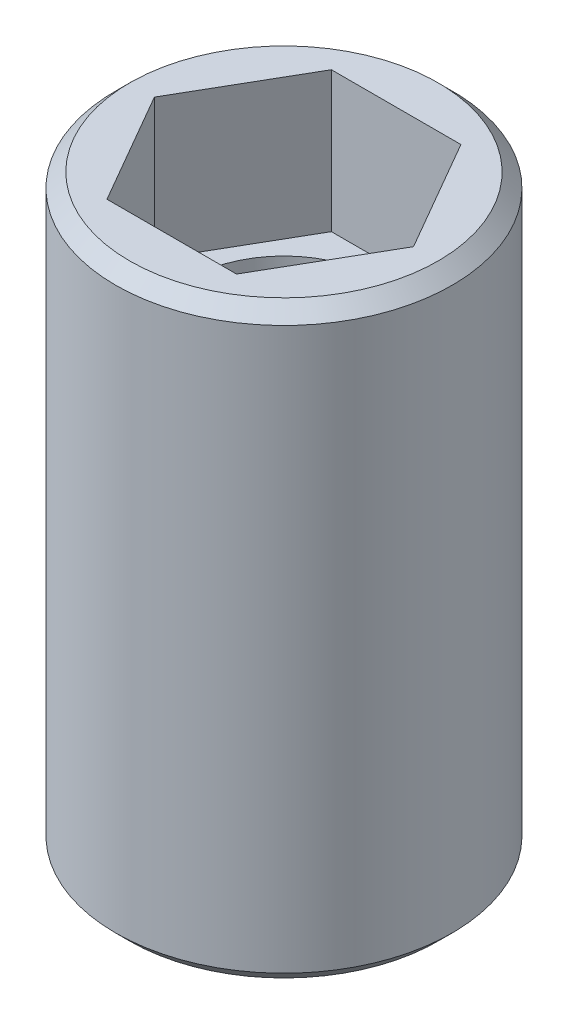
ISO-10303-21;
HEADER;
FILE_DESCRIPTION(('STEP AP214'),'2;1');
FILE_NAME('part.step','',(''),(''),'','','');
FILE_SCHEMA(('AUTOMOTIVE_DESIGN { 1 0 10303 214 1 1 1 1 }'));
ENDSEC;
DATA;
#1=APPLICATION_CONTEXT('core data for automotive mechanical design processes');
#2=APPLICATION_PROTOCOL_DEFINITION('international standard','automotive_design',2000,#1);
#3=PRODUCT_CONTEXT('',#1,'mechanical');
#4=PRODUCT('Part','Part','',(#3));
#5=PRODUCT_RELATED_PRODUCT_CATEGORY('part','',(#4));
#6=PRODUCT_DEFINITION_FORMATION('','',#4);
#7=PRODUCT_DEFINITION_CONTEXT('part definition',#1,'design');
#8=PRODUCT_DEFINITION('design','',#6,#7);
#9=PRODUCT_DEFINITION_SHAPE('','',#8);
#10=(LENGTH_UNIT() NAMED_UNIT(*) SI_UNIT(.MILLI.,.METRE.));
#11=(NAMED_UNIT(*) PLANE_ANGLE_UNIT() SI_UNIT($,.RADIAN.));
#12=(NAMED_UNIT(*) SI_UNIT($,.STERADIAN.) SOLID_ANGLE_UNIT());
#13=UNCERTAINTY_MEASURE_WITH_UNIT(LENGTH_MEASURE(1.E-05),#10,'distance_accuracy_value','');
#14=(GEOMETRIC_REPRESENTATION_CONTEXT(3) GLOBAL_UNCERTAINTY_ASSIGNED_CONTEXT((#13)) GLOBAL_UNIT_ASSIGNED_CONTEXT((#10,
#11,#12)) REPRESENTATION_CONTEXT('',''));
#15=CARTESIAN_POINT('',(0.,0.,0.));
#16=DIRECTION('',(0.,0.,1.));
#17=DIRECTION('',(1.,0.,0.));
#18=AXIS2_PLACEMENT_3D('',#15,#16,#17);
#19=CARTESIAN_POINT('',(0.,-21.,0.));
#20=DIRECTION('',(0.,1.,0.));
#21=DIRECTION('',(0.,0.,1.));
#22=AXIS2_PLACEMENT_3D('',#19,#20,#21);
#23=CYLINDRICAL_SURFACE('',#22,3.4);
#24=CARTESIAN_POINT('',(0.,-21.,0.));
#25=DIRECTION('',(0.,1.,0.));
#26=DIRECTION('',(0.,0.,1.));
#27=AXIS2_PLACEMENT_3D('',#24,#25,#26);
#28=CIRCLE('',#27,3.4);
#29=CARTESIAN_POINT('',(0.,-21.,3.4));
#30=VERTEX_POINT('',#29);
#31=EDGE_CURVE('E181',#30,#30,#28,.T.);
#32=CARTESIAN_POINT('',(0.,-5.,0.));
#33=DIRECTION('',(0.,1.,0.));
#34=DIRECTION('',(0.,0.,1.));
#35=AXIS2_PLACEMENT_3D('',#32,#33,#34);
#36=CIRCLE('',#35,3.4);
#37=CARTESIAN_POINT('',(0.,-5.,3.4));
#38=VERTEX_POINT('',#37);
#39=EDGE_CURVE('E171',#38,#38,#36,.F.);
#40=CARTESIAN_POINT('',(0.,-21.,3.4));
#41=CARTESIAN_POINT('',(0.,-20.8333333333333,3.4));
#42=CARTESIAN_POINT('',(0.,-20.6666666666667,3.4));
#43=CARTESIAN_POINT('',(0.,-20.3333333333333,3.4));
#44=CARTESIAN_POINT('',(0.,-20.1666666666667,3.4));
#45=CARTESIAN_POINT('',(0.,-19.8333333333333,3.4));
#46=CARTESIAN_POINT('',(0.,-19.6666666666667,3.4));
#47=CARTESIAN_POINT('',(0.,-19.3333333333333,3.4));
#48=CARTESIAN_POINT('',(0.,-19.1666666666667,3.4));
#49=CARTESIAN_POINT('',(0.,-18.8333333333333,3.4));
#50=CARTESIAN_POINT('',(0.,-18.6666666666667,3.4));
#51=CARTESIAN_POINT('',(0.,-18.3333333333333,3.4));
#52=CARTESIAN_POINT('',(0.,-18.1666666666667,3.4));
#53=CARTESIAN_POINT('',(0.,-17.8333333333333,3.4));
#54=CARTESIAN_POINT('',(0.,-17.6666666666667,3.4));
#55=CARTESIAN_POINT('',(0.,-17.3333333333333,3.4));
#56=CARTESIAN_POINT('',(0.,-17.1666666666667,3.4));
#57=CARTESIAN_POINT('',(0.,-16.8333333333333,3.4));
#58=CARTESIAN_POINT('',(0.,-16.6666666666667,3.4));
#59=CARTESIAN_POINT('',(0.,-16.3333333333333,3.4));
#60=CARTESIAN_POINT('',(0.,-16.1666666666667,3.4));
#61=CARTESIAN_POINT('',(0.,-15.8333333333333,3.4));
#62=CARTESIAN_POINT('',(0.,-15.6666666666667,3.4));
#63=CARTESIAN_POINT('',(0.,-15.3333333333333,3.4));
#64=CARTESIAN_POINT('',(0.,-15.1666666666667,3.4));
#65=CARTESIAN_POINT('',(0.,-14.8333333333333,3.4));
#66=CARTESIAN_POINT('',(0.,-14.6666666666667,3.4));
#67=CARTESIAN_POINT('',(0.,-14.3333333333333,3.4));
#68=CARTESIAN_POINT('',(0.,-14.1666666666667,3.4));
#69=CARTESIAN_POINT('',(0.,-13.8333333333333,3.4));
#70=CARTESIAN_POINT('',(0.,-13.6666666666667,3.4));
#71=CARTESIAN_POINT('',(0.,-13.3333333333333,3.4));
#72=CARTESIAN_POINT('',(0.,-13.1666666666667,3.4));
#73=CARTESIAN_POINT('',(0.,-12.8333333333333,3.4));
#74=CARTESIAN_POINT('',(0.,-12.6666666666667,3.4));
#75=CARTESIAN_POINT('',(0.,-12.3333333333333,3.4));
#76=CARTESIAN_POINT('',(0.,-12.1666666666667,3.4));
#77=CARTESIAN_POINT('',(0.,-11.8333333333333,3.4));
#78=CARTESIAN_POINT('',(0.,-11.6666666666667,3.4));
#79=CARTESIAN_POINT('',(0.,-11.3333333333333,3.4));
#80=CARTESIAN_POINT('',(0.,-11.1666666666667,3.4));
#81=CARTESIAN_POINT('',(0.,-10.8333333333333,3.4));
#82=CARTESIAN_POINT('',(0.,-10.6666666666667,3.4));
#83=CARTESIAN_POINT('',(0.,-10.3333333333333,3.4));
#84=CARTESIAN_POINT('',(0.,-10.1666666666667,3.4));
#85=CARTESIAN_POINT('',(0.,-9.83333333333333,3.4));
#86=CARTESIAN_POINT('',(0.,-9.66666666666667,3.4));
#87=CARTESIAN_POINT('',(0.,-9.33333333333333,3.4));
#88=CARTESIAN_POINT('',(0.,-9.16666666666667,3.4));
#89=CARTESIAN_POINT('',(0.,-8.83333333333334,3.4));
#90=CARTESIAN_POINT('',(0.,-8.66666666666667,3.4));
#91=CARTESIAN_POINT('',(0.,-8.33333333333334,3.4));
#92=CARTESIAN_POINT('',(0.,-8.16666666666667,3.4));
#93=CARTESIAN_POINT('',(0.,-7.83333333333333,3.4));
#94=CARTESIAN_POINT('',(0.,-7.66666666666667,3.4));
#95=CARTESIAN_POINT('',(0.,-7.33333333333333,3.4));
#96=CARTESIAN_POINT('',(0.,-7.16666666666667,3.4));
#97=CARTESIAN_POINT('',(0.,-6.83333333333333,3.4));
#98=CARTESIAN_POINT('',(0.,-6.66666666666667,3.4));
#99=CARTESIAN_POINT('',(0.,-6.33333333333333,3.4));
#100=CARTESIAN_POINT('',(0.,-6.16666666666667,3.4));
#101=CARTESIAN_POINT('',(0.,-5.83333333333334,3.4));
#102=CARTESIAN_POINT('',(0.,-5.66666666666667,3.4));
#103=CARTESIAN_POINT('',(0.,-5.33333333333334,3.4));
#104=CARTESIAN_POINT('',(0.,-5.16666666666667,3.4));
#105=CARTESIAN_POINT('',(0.,-5.,3.4));
#106=B_SPLINE_CURVE_WITH_KNOTS('',3,(#40,#41,#42,#43,#44,#45,#46,#47,#48,#49,#50,#51,#52,#53,
#54,#55,#56,#57,#58,#59,#60,#61,#62,#63,#64,#65,#66,#67,#68,#69,#70,#71,#72,#73,#74,#75,#76,#77,
#78,#79,#80,#81,#82,#83,#84,#85,#86,#87,#88,#89,#90,#91,#92,#93,#94,#95,#96,#97,#98,#99,#100,
#101,#102,#103,#104,#105),.UNSPECIFIED.,.F.,.F.,(4,2,2,2,2,2,2,2,2,2,2,2,2,2,2,2,2,2,2,2,2,2,2,
2,2,2,2,2,2,2,2,2,4),(0.,0.5,1.,1.5,2.,2.5,3.,3.5,4.,4.5,5.,5.5,6.,6.5,7.,7.5,8.,8.5,9.,9.5,10.,
10.5,11.,11.5,12.,12.5,13.,13.5,14.,14.5,15.,15.5,16.),.UNSPECIFIED.);
#107=EDGE_CURVE('BSEAM53',#30,#38,#106,.T.);
#108=ORIENTED_EDGE('',*,*,#31,.F.);
#109=ORIENTED_EDGE('',*,*,#39,.F.);
#110=ORIENTED_EDGE('',*,*,#107,.T.);
#111=ORIENTED_EDGE('',*,*,#107,.F.);
#112=EDGE_LOOP('',(#108,#110,#109,#111));
#113=FACE_BOUND('',#112,.T.);
#114=ADVANCED_FACE('F53',(#113),#23,.F.);
#115=CARTESIAN_POINT('',(0.,-21.,0.));
#116=DIRECTION('',(0.,1.,0.));
#117=DIRECTION('',(0.,0.,1.));
#118=AXIS2_PLACEMENT_3D('',#115,#116,#117);
#119=CYLINDRICAL_SURFACE('',#118,6.);
#120=CARTESIAN_POINT('',(0.,-0.5,0.));
#121=DIRECTION('',(0.,1.,0.));
#122=DIRECTION('',(0.,0.,1.));
#123=AXIS2_PLACEMENT_3D('',#120,#121,#122);
#124=CIRCLE('',#123,6.);
#125=CARTESIAN_POINT('',(0.,-0.5,6.));
#126=VERTEX_POINT('',#125);
#127=EDGE_CURVE('E63',#126,#126,#124,.F.);
#128=CARTESIAN_POINT('',(0.,-20.5,0.));
#129=DIRECTION('',(0.,1.,0.));
#130=DIRECTION('',(0.,0.,1.));
#131=AXIS2_PLACEMENT_3D('',#128,#129,#130);
#132=CIRCLE('',#131,6.);
#133=CARTESIAN_POINT('',(0.,-20.5,6.));
#134=VERTEX_POINT('',#133);
#135=EDGE_CURVE('E192',#134,#134,#132,.T.);
#136=CARTESIAN_POINT('',(0.,-0.5,6.));
#137=CARTESIAN_POINT('',(0.,-0.708333333333334,6.));
#138=CARTESIAN_POINT('',(0.,-0.916666666666668,6.));
#139=CARTESIAN_POINT('',(0.,-1.33333333333333,6.));
#140=CARTESIAN_POINT('',(0.,-1.54166666666667,6.));
#141=CARTESIAN_POINT('',(0.,-1.95833333333333,6.));
#142=CARTESIAN_POINT('',(0.,-2.16666666666667,6.));
#143=CARTESIAN_POINT('',(0.,-2.58333333333333,6.));
#144=CARTESIAN_POINT('',(0.,-2.79166666666667,6.));
#145=CARTESIAN_POINT('',(0.,-3.20833333333333,6.));
#146=CARTESIAN_POINT('',(0.,-3.41666666666667,6.));
#147=CARTESIAN_POINT('',(0.,-3.83333333333333,6.));
#148=CARTESIAN_POINT('',(0.,-4.04166666666667,6.));
#149=CARTESIAN_POINT('',(0.,-4.45833333333333,6.));
#150=CARTESIAN_POINT('',(0.,-4.66666666666666,6.));
#151=CARTESIAN_POINT('',(0.,-5.08333333333333,6.));
#152=CARTESIAN_POINT('',(0.,-5.29166666666666,6.));
#153=CARTESIAN_POINT('',(0.,-5.70833333333333,6.));
#154=CARTESIAN_POINT('',(0.,-5.91666666666666,6.));
#155=CARTESIAN_POINT('',(0.,-6.33333333333333,6.));
#156=CARTESIAN_POINT('',(0.,-6.54166666666666,6.));
#157=CARTESIAN_POINT('',(0.,-6.95833333333333,6.));
#158=CARTESIAN_POINT('',(0.,-7.16666666666666,6.));
#159=CARTESIAN_POINT('',(0.,-7.58333333333333,6.));
#160=CARTESIAN_POINT('',(0.,-7.79166666666666,6.));
#161=CARTESIAN_POINT('',(0.,-8.20833333333333,6.));
#162=CARTESIAN_POINT('',(0.,-8.41666666666666,6.));
#163=CARTESIAN_POINT('',(0.,-8.83333333333333,6.));
#164=CARTESIAN_POINT('',(0.,-9.04166666666666,6.));
#165=CARTESIAN_POINT('',(0.,-9.45833333333333,6.));
#166=CARTESIAN_POINT('',(0.,-9.66666666666666,6.));
#167=CARTESIAN_POINT('',(0.,-10.0833333333333,6.));
#168=CARTESIAN_POINT('',(0.,-10.2916666666667,6.));
#169=CARTESIAN_POINT('',(0.,-10.7083333333333,6.));
#170=CARTESIAN_POINT('',(0.,-10.9166666666667,6.));
#171=CARTESIAN_POINT('',(0.,-11.3333333333333,6.));
#172=CARTESIAN_POINT('',(0.,-11.5416666666667,6.));
#173=CARTESIAN_POINT('',(0.,-11.9583333333333,6.));
#174=CARTESIAN_POINT('',(0.,-12.1666666666667,6.));
#175=CARTESIAN_POINT('',(0.,-12.5833333333333,6.));
#176=CARTESIAN_POINT('',(0.,-12.7916666666667,6.));
#177=CARTESIAN_POINT('',(0.,-13.2083333333333,6.));
#178=CARTESIAN_POINT('',(0.,-13.4166666666667,6.));
#179=CARTESIAN_POINT('',(0.,-13.8333333333333,6.));
#180=CARTESIAN_POINT('',(0.,-14.0416666666667,6.));
#181=CARTESIAN_POINT('',(0.,-14.4583333333333,6.));
#182=CARTESIAN_POINT('',(0.,-14.6666666666667,6.));
#183=CARTESIAN_POINT('',(0.,-15.0833333333333,6.));
#184=CARTESIAN_POINT('',(0.,-15.2916666666667,6.));
#185=CARTESIAN_POINT('',(0.,-15.7083333333333,6.));
#186=CARTESIAN_POINT('',(0.,-15.9166666666667,6.));
#187=CARTESIAN_POINT('',(0.,-16.3333333333333,6.));
#188=CARTESIAN_POINT('',(0.,-16.5416666666667,6.));
#189=CARTESIAN_POINT('',(0.,-16.9583333333333,6.));
#190=CARTESIAN_POINT('',(0.,-17.1666666666667,6.));
#191=CARTESIAN_POINT('',(0.,-17.5833333333333,6.));
#192=CARTESIAN_POINT('',(0.,-17.7916666666667,6.));
#193=CARTESIAN_POINT('',(0.,-18.2083333333333,6.));
#194=CARTESIAN_POINT('',(0.,-18.4166666666667,6.));
#195=CARTESIAN_POINT('',(0.,-18.8333333333333,6.));
#196=CARTESIAN_POINT('',(0.,-19.0416666666667,6.));
#197=CARTESIAN_POINT('',(0.,-19.4583333333333,6.));
#198=CARTESIAN_POINT('',(0.,-19.6666666666667,6.));
#199=CARTESIAN_POINT('',(0.,-20.0833333333333,6.));
#200=CARTESIAN_POINT('',(0.,-20.2916666666667,6.));
#201=CARTESIAN_POINT('',(0.,-20.5,6.));
#202=B_SPLINE_CURVE_WITH_KNOTS('',3,(#136,#137,#138,#139,#140,#141,#142,#143,#144,#145,#146,
#147,#148,#149,#150,#151,#152,#153,#154,#155,#156,#157,#158,#159,#160,#161,#162,#163,#164,#165,
#166,#167,#168,#169,#170,#171,#172,#173,#174,#175,#176,#177,#178,#179,#180,#181,#182,#183,#184,
#185,#186,#187,#188,#189,#190,#191,#192,#193,#194,#195,#196,#197,#198,#199,#200,#201),
.UNSPECIFIED.,.F.,.F.,(4,2,2,2,2,2,2,2,2,2,2,2,2,2,2,2,2,2,2,2,2,2,2,2,2,2,2,2,2,2,2,2,4),(0.,
0.625000000000001,1.25,1.875,2.5,3.125,3.75,4.375,5.,5.625,6.25,6.87499999999999,
7.49999999999999,8.12499999999999,8.74999999999999,9.37499999999999,9.99999999999999,10.625,
11.25,11.875,12.5,13.125,13.75,14.375,15.,15.625,16.25,16.875,17.5,18.125,18.75,19.375,20.),.UNSPECIFIED.);
#203=EDGE_CURVE('BSEAM200',#126,#134,#202,.T.);
#204=ORIENTED_EDGE('',*,*,#127,.T.);
#205=ORIENTED_EDGE('',*,*,#135,.T.);
#206=ORIENTED_EDGE('',*,*,#203,.T.);
#207=ORIENTED_EDGE('',*,*,#203,.F.);
#208=EDGE_LOOP('',(#204,#206,#205,#207));
#209=FACE_BOUND('',#208,.T.);
#210=ADVANCED_FACE('F200',(#209),#119,.T.);
#211=CARTESIAN_POINT('',(0.,-21.,0.));
#212=DIRECTION('',(0.,1.,0.));
#213=DIRECTION('',(0.,0.,1.));
#214=AXIS2_PLACEMENT_3D('',#211,#212,#213);
#215=PLANE('',#214);
#216=CARTESIAN_POINT('',(0.,-21.,0.));
#217=DIRECTION('',(0.,1.,0.));
#218=DIRECTION('',(0.,0.,1.));
#219=AXIS2_PLACEMENT_3D('',#216,#217,#218);
#220=CIRCLE('',#219,5.49999999999998);
#221=CARTESIAN_POINT('',(0.,-21.,5.49999999999998));
#222=VERTEX_POINT('',#221);
#223=EDGE_CURVE('E11',#222,#222,#220,.F.);
#224=ORIENTED_EDGE('',*,*,#223,.T.);
#225=EDGE_LOOP('',(#224));
#226=FACE_BOUND('',#225,.T.);
#227=ORIENTED_EDGE('',*,*,#31,.T.);
#228=EDGE_LOOP('',(#227));
#229=FACE_BOUND('',#228,.T.);
#230=ADVANCED_FACE('F212',(#226,#229),#215,.F.);
#231=CARTESIAN_POINT('',(0.,0.,0.));
#232=DIRECTION('',(0.,1.,0.));
#233=DIRECTION('',(0.,0.,1.));
#234=AXIS2_PLACEMENT_3D('',#231,#232,#233);
#235=PLANE('',#234);
#236=CARTESIAN_POINT('',(0.,0.,0.));
#237=DIRECTION('',(0.,1.,0.));
#238=DIRECTION('',(0.,0.,1.));
#239=AXIS2_PLACEMENT_3D('',#236,#237,#238);
#240=CIRCLE('',#239,5.5);
#241=CARTESIAN_POINT('',(0.,0.,5.5));
#242=VERTEX_POINT('',#241);
#243=EDGE_CURVE('E185',#242,#242,#240,.T.);
#244=ORIENTED_EDGE('',*,*,#243,.T.);
#245=EDGE_LOOP('',(#244));
#246=FACE_BOUND('',#245,.T.);
#247=DIRECTION('',(0.5,0.,-0.866025403784439));
#248=VECTOR('',#247,1.);
#249=CARTESIAN_POINT('',(2.3094010767585,0.,4.));
#250=LINE('',#249,#248);
#251=CARTESIAN_POINT('',(2.3094010767585,0.,4.));
#252=VERTEX_POINT('',#251);
#253=CARTESIAN_POINT('',(4.61880215351701,0.,0.));
#254=VERTEX_POINT('',#253);
#255=EDGE_CURVE('E70',#252,#254,#250,.T.);
#256=ORIENTED_EDGE('',*,*,#255,.F.);
#257=DIRECTION('',(1.,0.,0.));
#258=VECTOR('',#257,1.);
#259=CARTESIAN_POINT('',(-2.3094010767585,0.,4.));
#260=LINE('',#259,#258);
#261=CARTESIAN_POINT('',(-2.3094010767585,0.,4.));
#262=VERTEX_POINT('',#261);
#263=EDGE_CURVE('E165',#262,#252,#260,.T.);
#264=ORIENTED_EDGE('',*,*,#263,.F.);
#265=DIRECTION('',(0.5,0.,0.866025403784439));
#266=VECTOR('',#265,1.);
#267=CARTESIAN_POINT('',(-4.61880215351701,0.,0.));
#268=LINE('',#267,#266);
#269=CARTESIAN_POINT('',(-4.61880215351701,0.,0.));
#270=VERTEX_POINT('',#269);
#271=EDGE_CURVE('E162',#270,#262,#268,.T.);
#272=ORIENTED_EDGE('',*,*,#271,.F.);
#273=DIRECTION('',(-0.5,0.,0.866025403784439));
#274=VECTOR('',#273,1.);
#275=CARTESIAN_POINT('',(-2.3094010767585,0.,-4.));
#276=LINE('',#275,#274);
#277=CARTESIAN_POINT('',(-2.3094010767585,0.,-4.));
#278=VERTEX_POINT('',#277);
#279=EDGE_CURVE('E118',#278,#270,#276,.T.);
#280=ORIENTED_EDGE('',*,*,#279,.F.);
#281=DIRECTION('',(-1.,0.,0.));
#282=VECTOR('',#281,1.);
#283=CARTESIAN_POINT('',(2.3094010767585,0.,-4.));
#284=LINE('',#283,#282);
#285=CARTESIAN_POINT('',(2.3094010767585,0.,-4.));
#286=VERTEX_POINT('',#285);
#287=EDGE_CURVE('E156',#286,#278,#284,.T.);
#288=ORIENTED_EDGE('',*,*,#287,.F.);
#289=DIRECTION('',(-0.5,0.,-0.866025403784438));
#290=VECTOR('',#289,1.);
#291=CARTESIAN_POINT('',(4.61880215351701,0.,0.));
#292=LINE('',#291,#290);
#293=EDGE_CURVE('E152',#254,#286,#292,.T.);
#294=ORIENTED_EDGE('',*,*,#293,.F.);
#295=EDGE_LOOP('',(#256,#264,#272,#280,#288,#294));
#296=FACE_BOUND('',#295,.T.);
#297=ADVANCED_FACE('F209',(#246,#296),#235,.T.);
#298=CARTESIAN_POINT('',(0.,-5.,0.));
#299=DIRECTION('',(0.,1.,0.));
#300=DIRECTION('',(0.,0.,1.));
#301=AXIS2_PLACEMENT_3D('',#298,#299,#300);
#302=PLANE('',#301);
#303=DIRECTION('',(0.5,0.,-0.866025403784439));
#304=VECTOR('',#303,1.);
#305=CARTESIAN_POINT('',(2.3094010767585,-5.,4.));
#306=LINE('',#305,#304);
#307=CARTESIAN_POINT('',(2.3094010767585,-5.,4.));
#308=VERTEX_POINT('',#307);
#309=CARTESIAN_POINT('',(4.61880215351701,-5.,0.));
#310=VERTEX_POINT('',#309);
#311=EDGE_CURVE('E168',#308,#310,#306,.T.);
#312=ORIENTED_EDGE('',*,*,#311,.T.);
#313=DIRECTION('',(-0.5,0.,-0.866025403784438));
#314=VECTOR('',#313,1.);
#315=CARTESIAN_POINT('',(4.61880215351701,-5.,0.));
#316=LINE('',#315,#314);
#317=CARTESIAN_POINT('',(2.3094010767585,-5.,-4.));
#318=VERTEX_POINT('',#317);
#319=EDGE_CURVE('E144',#310,#318,#316,.T.);
#320=ORIENTED_EDGE('',*,*,#319,.T.);
#321=DIRECTION('',(-1.,0.,0.));
#322=VECTOR('',#321,1.);
#323=CARTESIAN_POINT('',(2.3094010767585,-5.,-4.));
#324=LINE('',#323,#322);
#325=CARTESIAN_POINT('',(-2.3094010767585,-5.,-4.));
#326=VERTEX_POINT('',#325);
#327=EDGE_CURVE('E139',#318,#326,#324,.T.);
#328=ORIENTED_EDGE('',*,*,#327,.T.);
#329=DIRECTION('',(-0.5,0.,0.866025403784439));
#330=VECTOR('',#329,1.);
#331=CARTESIAN_POINT('',(-2.3094010767585,-5.,-4.));
#332=LINE('',#331,#330);
#333=CARTESIAN_POINT('',(-4.61880215351701,-5.,0.));
#334=VERTEX_POINT('',#333);
#335=EDGE_CURVE('E115',#326,#334,#332,.T.);
#336=ORIENTED_EDGE('',*,*,#335,.T.);
#337=DIRECTION('',(0.5,0.,0.866025403784439));
#338=VECTOR('',#337,1.);
#339=CARTESIAN_POINT('',(-4.61880215351701,-5.,0.));
#340=LINE('',#339,#338);
#341=CARTESIAN_POINT('',(-2.3094010767585,-5.,4.));
#342=VERTEX_POINT('',#341);
#343=EDGE_CURVE('E127',#334,#342,#340,.T.);
#344=ORIENTED_EDGE('',*,*,#343,.T.);
#345=DIRECTION('',(1.,0.,0.));
#346=VECTOR('',#345,1.);
#347=CARTESIAN_POINT('',(-2.3094010767585,-5.,4.));
#348=LINE('',#347,#346);
#349=EDGE_CURVE('E132',#342,#308,#348,.T.);
#350=ORIENTED_EDGE('',*,*,#349,.T.);
#351=EDGE_LOOP('',(#312,#320,#328,#336,#344,#350));
#352=FACE_BOUND('',#351,.T.);
#353=ORIENTED_EDGE('',*,*,#39,.T.);
#354=EDGE_LOOP('',(#353));
#355=FACE_BOUND('',#354,.T.);
#356=ADVANCED_FACE('F135',(#352,#355),#302,.T.);
#357=CARTESIAN_POINT('',(2.3094010767585,-5.,4.));
#358=DIRECTION('',(0.866025403784438,0.,0.5));
#359=DIRECTION('',(0.5,0.,-0.866025403784438));
#360=AXIS2_PLACEMENT_3D('',#357,#358,#359);
#361=PLANE('',#360);
#362=ORIENTED_EDGE('',*,*,#255,.T.);
#363=DIRECTION('',(0.,1.,0.));
#364=VECTOR('',#363,1.);
#365=CARTESIAN_POINT('',(4.61880215351701,-5.,0.));
#366=LINE('',#365,#364);
#367=EDGE_CURVE('E100',#310,#254,#366,.T.);
#368=ORIENTED_EDGE('',*,*,#367,.F.);
#369=ORIENTED_EDGE('',*,*,#311,.F.);
#370=DIRECTION('',(0.,1.,0.));
#371=VECTOR('',#370,1.);
#372=CARTESIAN_POINT('',(2.3094010767585,-5.,4.));
#373=LINE('',#372,#371);
#374=EDGE_CURVE('E78',#308,#252,#373,.T.);
#375=ORIENTED_EDGE('',*,*,#374,.T.);
#376=EDGE_LOOP('',(#362,#368,#369,#375));
#377=FACE_BOUND('',#376,.T.);
#378=ADVANCED_FACE('F230',(#377),#361,.F.);
#379=CARTESIAN_POINT('',(-2.3094010767585,-5.,4.));
#380=DIRECTION('',(0.,0.,1.));
#381=DIRECTION('',(1.,0.,0.));
#382=AXIS2_PLACEMENT_3D('',#379,#380,#381);
#383=PLANE('',#382);
#384=ORIENTED_EDGE('',*,*,#263,.T.);
#385=ORIENTED_EDGE('',*,*,#374,.F.);
#386=ORIENTED_EDGE('',*,*,#349,.F.);
#387=DIRECTION('',(0.,1.,0.));
#388=VECTOR('',#387,1.);
#389=CARTESIAN_POINT('',(-2.3094010767585,-5.,4.));
#390=LINE('',#389,#388);
#391=EDGE_CURVE('E123',#342,#262,#390,.T.);
#392=ORIENTED_EDGE('',*,*,#391,.T.);
#393=EDGE_LOOP('',(#384,#385,#386,#392));
#394=FACE_BOUND('',#393,.T.);
#395=ADVANCED_FACE('F232',(#394),#383,.F.);
#396=CARTESIAN_POINT('',(-4.61880215351701,-5.,0.));
#397=DIRECTION('',(-0.866025403784439,0.,0.5));
#398=DIRECTION('',(0.5,0.,0.866025403784439));
#399=AXIS2_PLACEMENT_3D('',#396,#397,#398);
#400=PLANE('',#399);
#401=ORIENTED_EDGE('',*,*,#271,.T.);
#402=ORIENTED_EDGE('',*,*,#391,.F.);
#403=ORIENTED_EDGE('',*,*,#343,.F.);
#404=DIRECTION('',(0.,1.,0.));
#405=VECTOR('',#404,1.);
#406=CARTESIAN_POINT('',(-4.61880215351701,-5.,0.));
#407=LINE('',#406,#405);
#408=EDGE_CURVE('E111',#334,#270,#407,.T.);
#409=ORIENTED_EDGE('',*,*,#408,.T.);
#410=EDGE_LOOP('',(#401,#402,#403,#409));
#411=FACE_BOUND('',#410,.T.);
#412=ADVANCED_FACE('F128',(#411),#400,.F.);
#413=CARTESIAN_POINT('',(-2.3094010767585,-5.,-4.));
#414=DIRECTION('',(-0.866025403784439,0.,-0.5));
#415=DIRECTION('',(-0.5,0.,0.866025403784439));
#416=AXIS2_PLACEMENT_3D('',#413,#414,#415);
#417=PLANE('',#416);
#418=ORIENTED_EDGE('',*,*,#279,.T.);
#419=ORIENTED_EDGE('',*,*,#408,.F.);
#420=ORIENTED_EDGE('',*,*,#335,.F.);
#421=DIRECTION('',(0.,1.,0.));
#422=VECTOR('',#421,1.);
#423=CARTESIAN_POINT('',(-2.3094010767585,-5.,-4.));
#424=LINE('',#423,#422);
#425=EDGE_CURVE('E124',#326,#278,#424,.T.);
#426=ORIENTED_EDGE('',*,*,#425,.T.);
#427=EDGE_LOOP('',(#418,#419,#420,#426));
#428=FACE_BOUND('',#427,.T.);
#429=ADVANCED_FACE('F113',(#428),#417,.F.);
#430=CARTESIAN_POINT('',(2.3094010767585,-5.,-4.));
#431=DIRECTION('',(0.,0.,-1.));
#432=DIRECTION('',(-1.,0.,0.));
#433=AXIS2_PLACEMENT_3D('',#430,#431,#432);
#434=PLANE('',#433);
#435=ORIENTED_EDGE('',*,*,#287,.T.);
#436=ORIENTED_EDGE('',*,*,#425,.F.);
#437=ORIENTED_EDGE('',*,*,#327,.F.);
#438=DIRECTION('',(0.,1.,0.));
#439=VECTOR('',#438,1.);
#440=CARTESIAN_POINT('',(2.3094010767585,-5.,-4.));
#441=LINE('',#440,#439);
#442=EDGE_CURVE('E176',#318,#286,#441,.T.);
#443=ORIENTED_EDGE('',*,*,#442,.T.);
#444=EDGE_LOOP('',(#435,#436,#437,#443));
#445=FACE_BOUND('',#444,.T.);
#446=ADVANCED_FACE('F328',(#445),#434,.F.);
#447=CARTESIAN_POINT('',(4.61880215351701,-5.,0.));
#448=DIRECTION('',(0.866025403784438,0.,-0.5));
#449=DIRECTION('',(-0.5,0.,-0.866025403784438));
#450=AXIS2_PLACEMENT_3D('',#447,#448,#449);
#451=PLANE('',#450);
#452=ORIENTED_EDGE('',*,*,#293,.T.);
#453=ORIENTED_EDGE('',*,*,#442,.F.);
#454=ORIENTED_EDGE('',*,*,#319,.F.);
#455=ORIENTED_EDGE('',*,*,#367,.T.);
#456=EDGE_LOOP('',(#452,#453,#454,#455));
#457=FACE_BOUND('',#456,.T.);
#458=ADVANCED_FACE('F206',(#457),#451,.F.);
#459=CARTESIAN_POINT('',(0.,0.,0.));
#460=DIRECTION('',(0.,-1.,0.));
#461=DIRECTION('',(0.,0.,-1.));
#462=AXIS2_PLACEMENT_3D('',#459,#460,#461);
#463=CONICAL_SURFACE('',#462,5.5,0.785398163397448);
#464=ORIENTED_EDGE('',*,*,#127,.F.);
#465=EDGE_LOOP('',(#464));
#466=FACE_BOUND('',#465,.T.);
#467=ORIENTED_EDGE('',*,*,#243,.F.);
#468=EDGE_LOOP('',(#467));
#469=FACE_BOUND('',#468,.T.);
#470=ADVANCED_FACE('F203',(#466,#469),#463,.T.);
#471=CARTESIAN_POINT('',(0.,-20.5,0.));
#472=DIRECTION('',(0.,1.,0.));
#473=DIRECTION('',(0.,0.,1.));
#474=AXIS2_PLACEMENT_3D('',#471,#472,#473);
#475=CONICAL_SURFACE('',#474,6.,0.78539816339745);
#476=ORIENTED_EDGE('',*,*,#223,.F.);
#477=EDGE_LOOP('',(#476));
#478=FACE_BOUND('',#477,.T.);
#479=ORIENTED_EDGE('',*,*,#135,.F.);
#480=EDGE_LOOP('',(#479));
#481=FACE_BOUND('',#480,.T.);
#482=ADVANCED_FACE('F56',(#478,#481),#475,.T.);
#483=CLOSED_SHELL('',(#114,#210,#230,#297,#356,#378,#395,#412,#429,#446,#458,#470,#482));
#484=MANIFOLD_SOLID_BREP('B2',#483);
#485=ADVANCED_BREP_SHAPE_REPRESENTATION('',(#18,#484),#14);
#486=SHAPE_DEFINITION_REPRESENTATION(#9,#485);
ENDSEC;
END-ISO-10303-21;
